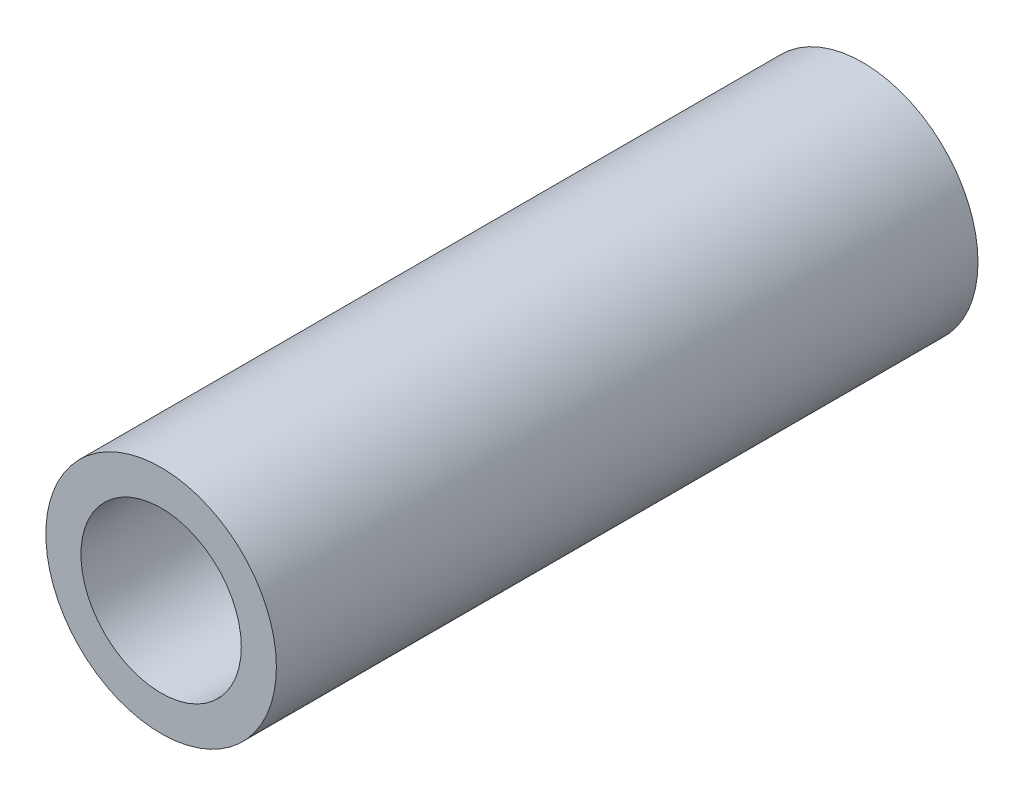
ISO-10303-21;
HEADER;
FILE_DESCRIPTION(('STEP AP214'),'2;1');
FILE_NAME('part.step','',(''),(''),'','','');
FILE_SCHEMA(('AUTOMOTIVE_DESIGN { 1 0 10303 214 1 1 1 1 }'));
ENDSEC;
DATA;
#1=APPLICATION_CONTEXT('core data for automotive mechanical design processes');
#2=APPLICATION_PROTOCOL_DEFINITION('international standard','automotive_design',2000,#1);
#3=PRODUCT_CONTEXT('',#1,'mechanical');
#4=PRODUCT('Part','Part','',(#3));
#5=PRODUCT_RELATED_PRODUCT_CATEGORY('part','',(#4));
#6=PRODUCT_DEFINITION_FORMATION('','',#4);
#7=PRODUCT_DEFINITION_CONTEXT('part definition',#1,'design');
#8=PRODUCT_DEFINITION('design','',#6,#7);
#9=PRODUCT_DEFINITION_SHAPE('','',#8);
#10=(LENGTH_UNIT() NAMED_UNIT(*) SI_UNIT(.MILLI.,.METRE.));
#11=(NAMED_UNIT(*) PLANE_ANGLE_UNIT() SI_UNIT($,.RADIAN.));
#12=(NAMED_UNIT(*) SI_UNIT($,.STERADIAN.) SOLID_ANGLE_UNIT());
#13=UNCERTAINTY_MEASURE_WITH_UNIT(LENGTH_MEASURE(1.E-05),#10,'distance_accuracy_value','');
#14=(GEOMETRIC_REPRESENTATION_CONTEXT(3) GLOBAL_UNCERTAINTY_ASSIGNED_CONTEXT((#13)) GLOBAL_UNIT_ASSIGNED_CONTEXT((#10,
#11,#12)) REPRESENTATION_CONTEXT('',''));
#15=CARTESIAN_POINT('',(0.,0.,0.));
#16=DIRECTION('',(0.,0.,1.));
#17=DIRECTION('',(1.,0.,0.));
#18=AXIS2_PLACEMENT_3D('',#15,#16,#17);
#19=CARTESIAN_POINT('',(0.,0.,35.));
#20=DIRECTION('',(0.,0.,1.));
#21=DIRECTION('',(1.,0.,0.));
#22=AXIS2_PLACEMENT_3D('',#19,#20,#21);
#23=PLANE('',#22);
#24=CARTESIAN_POINT('',(0.,0.,35.));
#25=DIRECTION('',(0.,0.,1.));
#26=DIRECTION('',(1.,0.,0.));
#27=AXIS2_PLACEMENT_3D('',#24,#25,#26);
#28=CIRCLE('',#27,5.75);
#29=CARTESIAN_POINT('',(5.75,0.,35.));
#30=VERTEX_POINT('',#29);
#31=EDGE_CURVE('E10',#30,#30,#28,.T.);
#32=ORIENTED_EDGE('',*,*,#31,.T.);
#33=EDGE_LOOP('',(#32));
#34=FACE_BOUND('',#33,.T.);
#35=CARTESIAN_POINT('',(0.,0.,35.));
#36=DIRECTION('',(0.,0.,1.));
#37=DIRECTION('',(1.,0.,0.));
#38=AXIS2_PLACEMENT_3D('',#35,#36,#37);
#39=CIRCLE('',#38,4.);
#40=CARTESIAN_POINT('',(4.,0.,35.));
#41=VERTEX_POINT('',#40);
#42=EDGE_CURVE('E42',#41,#41,#39,.T.);
#43=ORIENTED_EDGE('',*,*,#42,.F.);
#44=EDGE_LOOP('',(#43));
#45=FACE_BOUND('',#44,.T.);
#46=ADVANCED_FACE('F31',(#34,#45),#23,.T.);
#47=CARTESIAN_POINT('',(0.,0.,0.));
#48=DIRECTION('',(0.,0.,1.));
#49=DIRECTION('',(1.,0.,0.));
#50=AXIS2_PLACEMENT_3D('',#47,#48,#49);
#51=PLANE('',#50);
#52=CARTESIAN_POINT('',(0.,0.,0.));
#53=DIRECTION('',(0.,0.,1.));
#54=DIRECTION('',(1.,0.,0.));
#55=AXIS2_PLACEMENT_3D('',#52,#53,#54);
#56=CIRCLE('',#55,5.75);
#57=CARTESIAN_POINT('',(5.75,0.,0.));
#58=VERTEX_POINT('',#57);
#59=EDGE_CURVE('E35',#58,#58,#56,.T.);
#60=ORIENTED_EDGE('',*,*,#59,.F.);
#61=EDGE_LOOP('',(#60));
#62=FACE_BOUND('',#61,.T.);
#63=CARTESIAN_POINT('',(0.,0.,0.));
#64=DIRECTION('',(0.,0.,1.));
#65=DIRECTION('',(1.,0.,0.));
#66=AXIS2_PLACEMENT_3D('',#63,#64,#65);
#67=CIRCLE('',#66,4.);
#68=CARTESIAN_POINT('',(4.,0.,0.));
#69=VERTEX_POINT('',#68);
#70=EDGE_CURVE('E44',#69,#69,#67,.T.);
#71=ORIENTED_EDGE('',*,*,#70,.T.);
#72=EDGE_LOOP('',(#71));
#73=FACE_BOUND('',#72,.T.);
#74=ADVANCED_FACE('F54',(#62,#73),#51,.F.);
#75=CARTESIAN_POINT('',(0.,0.,35.));
#76=DIRECTION('',(0.,0.,-1.));
#77=DIRECTION('',(-1.,0.,0.));
#78=AXIS2_PLACEMENT_3D('',#75,#76,#77);
#79=CYLINDRICAL_SURFACE('',#78,5.75);
#80=ORIENTED_EDGE('',*,*,#31,.F.);
#81=EDGE_LOOP('',(#80));
#82=FACE_BOUND('',#81,.T.);
#83=ORIENTED_EDGE('',*,*,#59,.T.);
#84=EDGE_LOOP('',(#83));
#85=FACE_BOUND('',#84,.T.);
#86=ADVANCED_FACE('F33',(#82,#85),#79,.T.);
#87=CARTESIAN_POINT('',(0.,0.,35.));
#88=DIRECTION('',(0.,0.,-1.));
#89=DIRECTION('',(-1.,0.,0.));
#90=AXIS2_PLACEMENT_3D('',#87,#88,#89);
#91=CYLINDRICAL_SURFACE('',#90,4.);
#92=ORIENTED_EDGE('',*,*,#42,.T.);
#93=EDGE_LOOP('',(#92));
#94=FACE_BOUND('',#93,.T.);
#95=ORIENTED_EDGE('',*,*,#70,.F.);
#96=EDGE_LOOP('',(#95));
#97=FACE_BOUND('',#96,.T.);
#98=ADVANCED_FACE('F50',(#94,#97),#91,.F.);
#99=CLOSED_SHELL('',(#46,#74,#86,#98));
#100=MANIFOLD_SOLID_BREP('B2',#99);
#101=ADVANCED_BREP_SHAPE_REPRESENTATION('',(#18,#100),#14);
#102=SHAPE_DEFINITION_REPRESENTATION(#9,#101);
ENDSEC;
END-ISO-10303-21;
